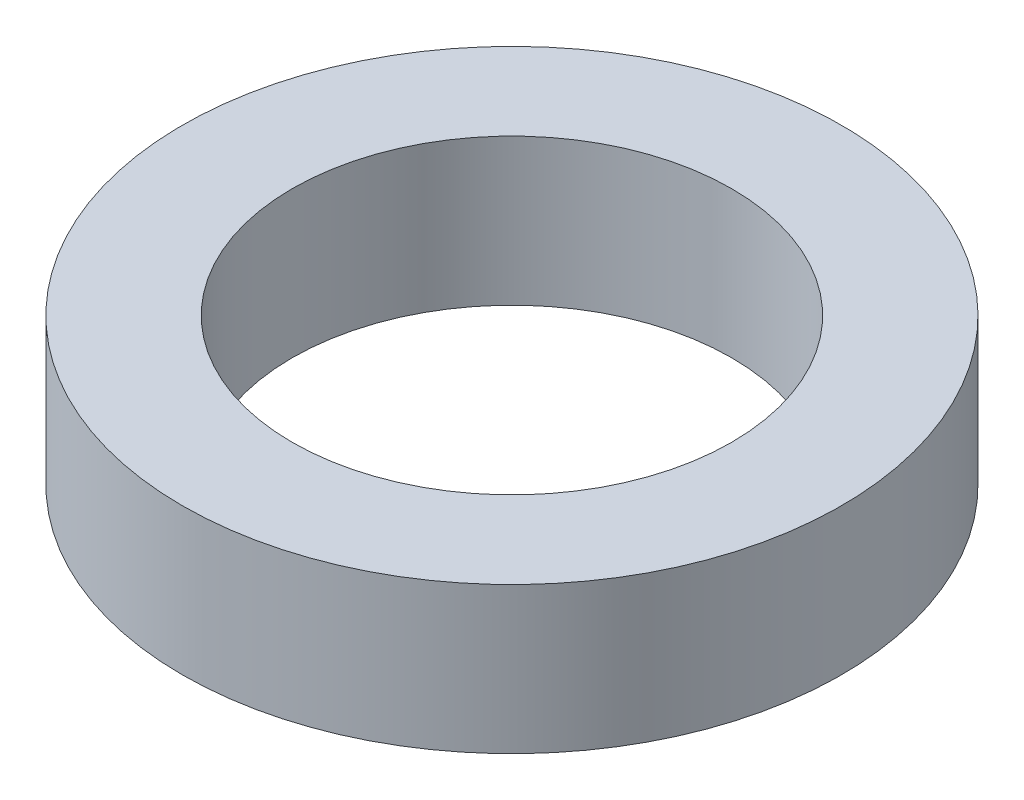
ISO-10303-21;
HEADER;
FILE_DESCRIPTION(('STEP AP214'),'2;1');
FILE_NAME('part.step','',(''),(''),'','','');
FILE_SCHEMA(('AUTOMOTIVE_DESIGN { 1 0 10303 214 1 1 1 1 }'));
ENDSEC;
DATA;
#1=APPLICATION_CONTEXT('core data for automotive mechanical design processes');
#2=APPLICATION_PROTOCOL_DEFINITION('international standard','automotive_design',2000,#1);
#3=PRODUCT_CONTEXT('',#1,'mechanical');
#4=PRODUCT('Part','Part','',(#3));
#5=PRODUCT_RELATED_PRODUCT_CATEGORY('part','',(#4));
#6=PRODUCT_DEFINITION_FORMATION('','',#4);
#7=PRODUCT_DEFINITION_CONTEXT('part definition',#1,'design');
#8=PRODUCT_DEFINITION('design','',#6,#7);
#9=PRODUCT_DEFINITION_SHAPE('','',#8);
#10=(LENGTH_UNIT() NAMED_UNIT(*) SI_UNIT(.MILLI.,.METRE.));
#11=(NAMED_UNIT(*) PLANE_ANGLE_UNIT() SI_UNIT($,.RADIAN.));
#12=(NAMED_UNIT(*) SI_UNIT($,.STERADIAN.) SOLID_ANGLE_UNIT());
#13=UNCERTAINTY_MEASURE_WITH_UNIT(LENGTH_MEASURE(1.E-05),#10,'distance_accuracy_value','');
#14=(GEOMETRIC_REPRESENTATION_CONTEXT(3) GLOBAL_UNCERTAINTY_ASSIGNED_CONTEXT((#13)) GLOBAL_UNIT_ASSIGNED_CONTEXT((#10,
#11,#12)) REPRESENTATION_CONTEXT('',''));
#15=CARTESIAN_POINT('',(0.,0.,0.));
#16=DIRECTION('',(0.,0.,1.));
#17=DIRECTION('',(1.,0.,0.));
#18=AXIS2_PLACEMENT_3D('',#15,#16,#17);
#19=CARTESIAN_POINT('',(0.,2.,0.));
#20=DIRECTION('',(0.,1.,0.));
#21=DIRECTION('',(0.,0.,1.));
#22=AXIS2_PLACEMENT_3D('',#19,#20,#21);
#23=PLANE('',#22);
#24=CARTESIAN_POINT('',(0.,2.,0.));
#25=DIRECTION('',(0.,1.,0.));
#26=DIRECTION('',(0.,0.,1.));
#27=AXIS2_PLACEMENT_3D('',#24,#25,#26);
#28=CIRCLE('',#27,4.5);
#29=CARTESIAN_POINT('',(0.,2.,4.5));
#30=VERTEX_POINT('',#29);
#31=EDGE_CURVE('E10',#30,#30,#28,.T.);
#32=ORIENTED_EDGE('',*,*,#31,.T.);
#33=EDGE_LOOP('',(#32));
#34=FACE_BOUND('',#33,.T.);
#35=CARTESIAN_POINT('',(0.,2.,0.));
#36=DIRECTION('',(0.,1.,0.));
#37=DIRECTION('',(0.,0.,1.));
#38=AXIS2_PLACEMENT_3D('',#35,#36,#37);
#39=CIRCLE('',#38,3.);
#40=CARTESIAN_POINT('',(0.,2.,3.));
#41=VERTEX_POINT('',#40);
#42=EDGE_CURVE('E50',#41,#41,#39,.T.);
#43=ORIENTED_EDGE('',*,*,#42,.F.);
#44=EDGE_LOOP('',(#43));
#45=FACE_BOUND('',#44,.T.);
#46=ADVANCED_FACE('F37',(#34,#45),#23,.T.);
#47=CARTESIAN_POINT('',(0.,0.,0.));
#48=DIRECTION('',(0.,1.,0.));
#49=DIRECTION('',(0.,0.,1.));
#50=AXIS2_PLACEMENT_3D('',#47,#48,#49);
#51=PLANE('',#50);
#52=CARTESIAN_POINT('',(0.,0.,0.));
#53=DIRECTION('',(0.,1.,0.));
#54=DIRECTION('',(0.,0.,1.));
#55=AXIS2_PLACEMENT_3D('',#52,#53,#54);
#56=CIRCLE('',#55,4.5);
#57=CARTESIAN_POINT('',(0.,0.,4.5));
#58=VERTEX_POINT('',#57);
#59=EDGE_CURVE('E41',#58,#58,#56,.T.);
#60=ORIENTED_EDGE('',*,*,#59,.F.);
#61=EDGE_LOOP('',(#60));
#62=FACE_BOUND('',#61,.T.);
#63=CARTESIAN_POINT('',(0.,0.,0.));
#64=DIRECTION('',(0.,1.,0.));
#65=DIRECTION('',(0.,0.,1.));
#66=AXIS2_PLACEMENT_3D('',#63,#64,#65);
#67=CIRCLE('',#66,3.);
#68=CARTESIAN_POINT('',(0.,0.,3.));
#69=VERTEX_POINT('',#68);
#70=EDGE_CURVE('E52',#69,#69,#67,.T.);
#71=ORIENTED_EDGE('',*,*,#70,.T.);
#72=EDGE_LOOP('',(#71));
#73=FACE_BOUND('',#72,.T.);
#74=ADVANCED_FACE('F64',(#62,#73),#51,.F.);
#75=CARTESIAN_POINT('',(0.,2.,0.));
#76=DIRECTION('',(0.,-1.,0.));
#77=DIRECTION('',(0.,0.,-1.));
#78=AXIS2_PLACEMENT_3D('',#75,#76,#77);
#79=CYLINDRICAL_SURFACE('',#78,4.5);
#80=ORIENTED_EDGE('',*,*,#31,.F.);
#81=EDGE_LOOP('',(#80));
#82=FACE_BOUND('',#81,.T.);
#83=ORIENTED_EDGE('',*,*,#59,.T.);
#84=EDGE_LOOP('',(#83));
#85=FACE_BOUND('',#84,.T.);
#86=ADVANCED_FACE('F39',(#82,#85),#79,.T.);
#87=CARTESIAN_POINT('',(0.,2.,0.));
#88=DIRECTION('',(0.,-1.,0.));
#89=DIRECTION('',(0.,0.,-1.));
#90=AXIS2_PLACEMENT_3D('',#87,#88,#89);
#91=CYLINDRICAL_SURFACE('',#90,3.);
#92=ORIENTED_EDGE('',*,*,#42,.T.);
#93=EDGE_LOOP('',(#92));
#94=FACE_BOUND('',#93,.T.);
#95=ORIENTED_EDGE('',*,*,#70,.F.);
#96=EDGE_LOOP('',(#95));
#97=FACE_BOUND('',#96,.T.);
#98=ADVANCED_FACE('F60',(#94,#97),#91,.F.);
#99=CLOSED_SHELL('',(#46,#74,#86,#98));
#100=MANIFOLD_SOLID_BREP('B2',#99);
#101=ADVANCED_BREP_SHAPE_REPRESENTATION('',(#18,#100),#14);
#102=SHAPE_DEFINITION_REPRESENTATION(#9,#101);
ENDSEC;
END-ISO-10303-21;
